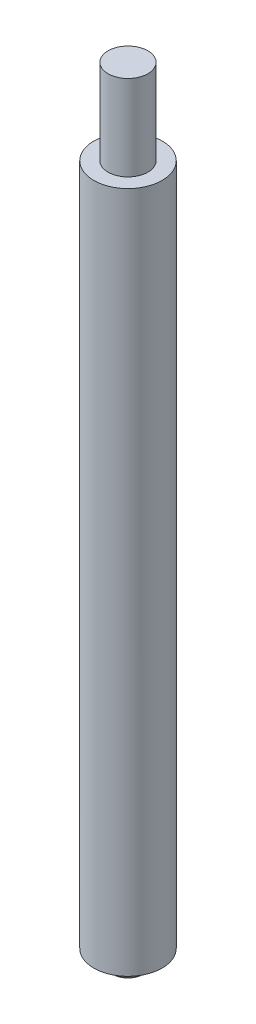
ISO-10303-21;
HEADER;
FILE_DESCRIPTION(('STEP AP214'),'2;1');
FILE_NAME('part.step','',(''),(''),'','','');
FILE_SCHEMA(('AUTOMOTIVE_DESIGN { 1 0 10303 214 1 1 1 1 }'));
ENDSEC;
DATA;
#1=APPLICATION_CONTEXT('core data for automotive mechanical design processes');
#2=APPLICATION_PROTOCOL_DEFINITION('international standard','automotive_design',2000,#1);
#3=PRODUCT_CONTEXT('',#1,'mechanical');
#4=PRODUCT('Part','Part','',(#3));
#5=PRODUCT_RELATED_PRODUCT_CATEGORY('part','',(#4));
#6=PRODUCT_DEFINITION_FORMATION('','',#4);
#7=PRODUCT_DEFINITION_CONTEXT('part definition',#1,'design');
#8=PRODUCT_DEFINITION('design','',#6,#7);
#9=PRODUCT_DEFINITION_SHAPE('','',#8);
#10=(LENGTH_UNIT() NAMED_UNIT(*) SI_UNIT(.MILLI.,.METRE.));
#11=(NAMED_UNIT(*) PLANE_ANGLE_UNIT() SI_UNIT($,.RADIAN.));
#12=(NAMED_UNIT(*) SI_UNIT($,.STERADIAN.) SOLID_ANGLE_UNIT());
#13=UNCERTAINTY_MEASURE_WITH_UNIT(LENGTH_MEASURE(1.E-05),#10,'distance_accuracy_value','');
#14=(GEOMETRIC_REPRESENTATION_CONTEXT(3) GLOBAL_UNCERTAINTY_ASSIGNED_CONTEXT((#13)) GLOBAL_UNIT_ASSIGNED_CONTEXT((#10,
#11,#12)) REPRESENTATION_CONTEXT('',''));
#15=CARTESIAN_POINT('',(0.,0.,0.));
#16=DIRECTION('',(0.,0.,1.));
#17=DIRECTION('',(1.,0.,0.));
#18=AXIS2_PLACEMENT_3D('',#15,#16,#17);
#19=CARTESIAN_POINT('',(-97.9858734622431,-22.870352222622,67.9054394861145));
#20=DIRECTION('',(0.,1.,0.));
#21=DIRECTION('',(1.,0.,0.));
#22=AXIS2_PLACEMENT_3D('',#19,#20,#21);
#23=PLANE('',#22);
#24=CARTESIAN_POINT('',(-96.5721765279553,-22.8703522226222,73.8228541123755));
#25=CARTESIAN_POINT('',(-96.5678260502752,-22.8703522226222,73.8435794193445));
#26=CARTESIAN_POINT('',(-96.5623770568825,-22.8703522226222,73.8640989212002));
#27=CARTESIAN_POINT('',(-96.5558401171276,-22.8703522226222,73.8843241617577));
#28=CARTESIAN_POINT('',(-96.5317525572248,-22.8703522226222,73.9588508840073));
#29=CARTESIAN_POINT('',(-96.4933489727974,-22.8703522226221,74.0279708231255));
#30=CARTESIAN_POINT('',(-96.4427811416982,-22.8703522226221,74.0877801707159));
#31=CARTESIAN_POINT('',(-96.3922995758884,-22.8703522226221,74.1474874876167));
#32=CARTESIAN_POINT('',(-96.330654159784,-22.870352222622,74.1967813069358));
#33=CARTESIAN_POINT('',(-96.2612949105251,-22.870352222622,74.23286910676));
#34=CARTESIAN_POINT('',(-96.1920509199817,-22.870352222622,74.2688969371714));
#35=CARTESIAN_POINT('',(-96.1164434075436,-22.870352222622,74.2910727687485));
#36=CARTESIAN_POINT('',(-96.0387088372715,-22.870352222622,74.2981297324957));
#37=CARTESIAN_POINT('',(-95.9610266768258,-22.870352222622,74.3051819383309));
#38=CARTESIAN_POINT('',(-95.8827169696455,-22.8703522226219,74.2969993340753));
#39=CARTESIAN_POINT('',(-95.8081731707342,-22.8703522226219,74.2740339420394));
#40=CARTESIAN_POINT('',(-95.7335732287633,-22.8703522226219,74.2510512534961));
#41=CARTESIAN_POINT('',(-95.6641874156283,-22.870352222622,74.2137080971474));
#42=CARTESIAN_POINT('',(-95.6039051839047,-22.870352222622,74.1641137920299));
#43=CARTESIAN_POINT('',(-95.543514616199,-22.870352222622,74.1144303586967));
#44=CARTESIAN_POINT('',(-95.4934258231242,-22.8703522226221,74.0534112071373));
#45=CARTESIAN_POINT('',(-95.4564364063864,-22.8703522226221,73.9845084659685));
#46=CARTESIAN_POINT('',(-95.4193806744219,-22.8703522226221,73.9154821948472));
#47=CARTESIAN_POINT('',(-95.3961809587493,-22.8703522226224,73.8398669097778));
#48=CARTESIAN_POINT('',(-95.3881220608928,-22.8703522226224,73.7619367553003));
#49=CARTESIAN_POINT('',(-95.3817014873842,-22.8703522226224,73.6998493217262));
#50=CARTESIAN_POINT('',(-95.3849883879078,-22.8703522226224,73.6372311463605));
#51=CARTESIAN_POINT('',(-95.397772510781,-22.8703522226224,73.5763288163803));
#52=B_SPLINE_CURVE_WITH_KNOTS('',3,(#24,#25,#26,#27,#28,#29,#30,#31,#32,#33,#34,#35,#36,#37,#38,
#39,#40,#41,#42,#43,#44,#45,#46,#47,#48,#49,#50,#51),.UNSPECIFIED.,.F.,.F.,(4,3,3,3,3,3,3,3,3,
4),(0.0906286338490975,0.0970048547971925,0.120500192034242,0.143955447819833,0.167371726501718,
0.190772217573301,0.214190332849484,0.237650533901896,0.261152794783485,0.279877190636576),.UNSPECIFIED.);
#53=CARTESIAN_POINT('',(-96.5721766503632,-22.870352222622,73.8228541380703));
#54=VERTEX_POINT('',#53);
#55=CARTESIAN_POINT('',(-95.3977724434223,-22.870352222622,73.5763288022409));
#56=VERTEX_POINT('',#55);
#57=EDGE_CURVE('P0_E11',#54,#56,#52,.T.);
#58=ORIENTED_EDGE('',*,*,#57,.T.);
#59=CARTESIAN_POINT('',(-95.397772510781,-22.8703522226224,73.5763288163803));
#60=CARTESIAN_POINT('',(-95.4010456859748,-22.8703522226224,73.5607357250351));
#61=CARTESIAN_POINT('',(-95.4049414384028,-22.8703522226224,73.5452551135535));
#62=CARTESIAN_POINT('',(-95.409456239205,-22.8703522226224,73.529924688609));
#63=CARTESIAN_POINT('',(-95.4315860140885,-22.8703522226224,73.4547809850999));
#64=CARTESIAN_POINT('',(-95.4681704440311,-22.8703522226222,73.3846664830277));
#65=CARTESIAN_POINT('',(-95.51716027325,-22.8703522226222,73.3235426049768));
#66=CARTESIAN_POINT('',(-95.5660594961008,-22.8703522226222,73.2625317751377));
#67=CARTESIAN_POINT('',(-95.6263903102962,-22.870352222622,73.2116366113214));
#68=CARTESIAN_POINT('',(-95.6947791253152,-22.870352222622,73.1737406724828));
#69=CARTESIAN_POINT('',(-95.748529026263,-22.870352222622,73.1439565190605));
#70=CARTESIAN_POINT('',(-95.80644642432,-22.870352222622,73.1226511297557));
#71=CARTESIAN_POINT('',(-95.8664819944071,-22.870352222622,73.1104975345015));
#72=B_SPLINE_CURVE_WITH_KNOTS('',3,(#59,#60,#61,#62,#63,#64,#65,#66,#67,#68,#69,#70,#71),
.UNSPECIFIED.,.F.,.F.,(4,3,3,3,4),(0.279877190636576,0.284671280041969,0.308170017629412,
0.331625294455703,0.350059870427905),.UNSPECIFIED.);
#73=CARTESIAN_POINT('',(-95.8664819944077,-22.870352222622,73.1104975345014));
#74=VERTEX_POINT('',#73);
#75=EDGE_CURVE('P0_E31',#56,#74,#72,.T.);
#76=ORIENTED_EDGE('',*,*,#75,.T.);
#77=CARTESIAN_POINT('',(-95.8664819944071,-22.870352222622,73.1104975345015));
#78=CARTESIAN_POINT('',(-95.8827000733265,-22.870352222622,73.1072143481055));
#79=CARTESIAN_POINT('',(-95.899072714911,-22.870352222622,73.1045989582061));
#80=CARTESIAN_POINT('',(-95.9155595245947,-22.870352222622,73.1026646605131));
#81=CARTESIAN_POINT('',(-95.9930286463105,-22.870352222622,73.0935756768782));
#82=CARTESIAN_POINT('',(-96.0715245349503,-22.8703522236215,73.0997004818225));
#83=CARTESIAN_POINT('',(-96.1466441789284,-22.8703522236215,73.1207014613094));
#84=CARTESIAN_POINT('',(-96.1892102298489,-22.8703522236215,73.132601527855));
#85=CARTESIAN_POINT('',(-96.2303273848794,-22.870352222622,73.1491761425467));
#86=CARTESIAN_POINT('',(-96.2692475759991,-22.870352222622,73.1701214581213));
#87=CARTESIAN_POINT('',(-96.3081760347507,-22.870352222622,73.1910712230102));
#88=CARTESIAN_POINT('',(-96.3446660994206,-22.8703522226219,73.2162640925919));
#89=CARTESIAN_POINT('',(-96.3780554770065,-22.8703522226219,73.2452379502376));
#90=CARTESIAN_POINT('',(-96.4371333856962,-22.8703522226219,73.2965032040442));
#91=CARTESIAN_POINT('',(-96.4856143840525,-22.870352222622,73.3588325752559));
#92=CARTESIAN_POINT('',(-96.5207897489313,-22.870352222622,73.4286993023566));
#93=CARTESIAN_POINT('',(-96.5560205009987,-22.870352222622,73.4986760417231));
#94=CARTESIAN_POINT('',(-96.5772301053577,-22.8703522226222,73.5748750280968));
#95=CARTESIAN_POINT('',(-96.5832427104637,-22.8703522226222,73.6529908384452));
#96=CARTESIAN_POINT('',(-96.5876271609219,-22.8703522226222,73.7099536514762));
#97=CARTESIAN_POINT('',(-96.5838700188268,-22.8703522226222,73.7671473128759));
#98=CARTESIAN_POINT('',(-96.5721765279553,-22.8703522226222,73.8228541123755));
#99=B_SPLINE_CURVE_WITH_KNOTS('',3,(#77,#78,#79,#80,#81,#82,#83,#84,#85,#86,#87,#88,#89,#90,#91,
#92,#93,#94,#95,#96,#97,#98),.UNSPECIFIED.,.F.,.F.,(4,3,3,3,3,3,3,4),(-0.0283799417962128,
-0.0234000039438561,0.,0.0132594579349294,0.0265217325137007,0.0499875022654272,
0.0734902212575653,0.0906286338490975),.UNSPECIFIED.);
#100=EDGE_CURVE('P0_E52',#74,#54,#99,.T.);
#101=ORIENTED_EDGE('',*,*,#100,.T.);
#102=EDGE_LOOP('',(#58,#76,#101));
#103=FACE_BOUND('',#102,.T.);
#104=ADVANCED_FACE('P0_F17',(#103),#23,.T.);
#105=CARTESIAN_POINT('',(-95.8664819944071,-22.870352222622,73.1104975345015));
#106=CARTESIAN_POINT('',(-95.8664819944071,-34.870352222622,73.1104975345015));
#107=CARTESIAN_POINT('',(-95.80644642432,-22.870352222622,73.1226511297557));
#108=CARTESIAN_POINT('',(-95.80644642432,-34.870352222622,73.1226511297557));
#109=CARTESIAN_POINT('',(-95.748529026263,-22.870352222622,73.1439565190605));
#110=CARTESIAN_POINT('',(-95.748529026263,-34.870352222622,73.1439565190605));
#111=CARTESIAN_POINT('',(-95.6263903102962,-22.870352222622,73.2116366113214));
#112=CARTESIAN_POINT('',(-95.6263903102962,-34.870352222622,73.2116366113214));
#113=CARTESIAN_POINT('',(-95.5660594961008,-22.8703522226222,73.2625317751377));
#114=CARTESIAN_POINT('',(-95.5660594961008,-34.8703522226222,73.2625317751377));
#115=CARTESIAN_POINT('',(-95.4681704440311,-22.8703522226222,73.3846664830277));
#116=CARTESIAN_POINT('',(-95.4681704440311,-34.8703522226222,73.3846664830277));
#117=CARTESIAN_POINT('',(-95.4315860140885,-22.8703522226224,73.4547809850999));
#118=CARTESIAN_POINT('',(-95.4315860140885,-34.8703522226224,73.4547809850999));
#119=CARTESIAN_POINT('',(-95.3873078670879,-22.8703522226224,73.6051315407502));
#120=CARTESIAN_POINT('',(-95.3873078670879,-34.8703522226224,73.6051315407502));
#121=CARTESIAN_POINT('',(-95.3800575997162,-22.8703522226224,73.6839528030966));
#122=CARTESIAN_POINT('',(-95.3800575997162,-34.8703522226224,73.6839528030966));
#123=CARTESIAN_POINT('',(-95.3961809587493,-22.8703522226224,73.8398669097778));
#124=CARTESIAN_POINT('',(-95.3961809587493,-34.8703522226224,73.8398669097778));
#125=CARTESIAN_POINT('',(-95.4193806744219,-22.8703522226221,73.9154821948472));
#126=CARTESIAN_POINT('',(-95.4193806744219,-34.8703522226222,73.9154821948472));
#127=CARTESIAN_POINT('',(-95.4934258231242,-22.8703522226221,74.0534112071373));
#128=CARTESIAN_POINT('',(-95.4934258231242,-34.8703522226222,74.0534112071373));
#129=CARTESIAN_POINT('',(-95.543514616199,-22.870352222622,74.1144303586967));
#130=CARTESIAN_POINT('',(-95.543514616199,-34.870352222622,74.1144303586967));
#131=CARTESIAN_POINT('',(-95.6641874156283,-22.870352222622,74.2137080971474));
#132=CARTESIAN_POINT('',(-95.6641874156283,-34.870352222622,74.2137080971474));
#133=CARTESIAN_POINT('',(-95.7335732287633,-22.8703522226219,74.2510512534961));
#134=CARTESIAN_POINT('',(-95.7335732287633,-34.8703522226219,74.2510512534961));
#135=CARTESIAN_POINT('',(-95.8827169696455,-22.8703522226219,74.2969993340753));
#136=CARTESIAN_POINT('',(-95.8827169696455,-34.8703522226219,74.2969993340753));
#137=CARTESIAN_POINT('',(-95.9610266768258,-22.870352222622,74.3051819383309));
#138=CARTESIAN_POINT('',(-95.9610266768258,-34.870352222622,74.3051819383309));
#139=CARTESIAN_POINT('',(-96.1164434075436,-22.870352222622,74.2910727687485));
#140=CARTESIAN_POINT('',(-96.1164434075436,-34.870352222622,74.2910727687485));
#141=CARTESIAN_POINT('',(-96.1920509199817,-22.870352222622,74.2688969371714));
#142=CARTESIAN_POINT('',(-96.1920509199817,-34.870352222622,74.2688969371714));
#143=CARTESIAN_POINT('',(-96.330654159784,-22.870352222622,74.1967813069358));
#144=CARTESIAN_POINT('',(-96.330654159784,-34.870352222622,74.1967813069358));
#145=CARTESIAN_POINT('',(-96.3922995758884,-22.8703522226221,74.1474874876167));
#146=CARTESIAN_POINT('',(-96.3922995758884,-34.8703522226221,74.1474874876167));
#147=CARTESIAN_POINT('',(-96.4933489727974,-22.8703522226221,74.0279708231255));
#148=CARTESIAN_POINT('',(-96.4933489727974,-34.8703522226221,74.0279708231255));
#149=CARTESIAN_POINT('',(-96.5317525572248,-22.8703522226222,73.9588508840073));
#150=CARTESIAN_POINT('',(-96.5317525572248,-34.8703522226222,73.9588508840073));
#151=CARTESIAN_POINT('',(-96.5799474597149,-22.8703522226222,73.8097362320368));
#152=CARTESIAN_POINT('',(-96.5799474597149,-34.8703522226222,73.8097362320368));
#153=CARTESIAN_POINT('',(-96.5892583636199,-22.8703522226222,73.7311462490853));
#154=CARTESIAN_POINT('',(-96.5892583636199,-34.8703522226222,73.7311462490853));
#155=CARTESIAN_POINT('',(-96.5772301053577,-22.8703522226222,73.5748750280968));
#156=CARTESIAN_POINT('',(-96.5772301053577,-34.8703522226222,73.5748750280968));
#157=CARTESIAN_POINT('',(-96.5560205009987,-22.870352222622,73.4986760417231));
#158=CARTESIAN_POINT('',(-96.5560205009987,-34.8703522226221,73.4986760417231));
#159=CARTESIAN_POINT('',(-96.4856143840525,-22.870352222622,73.3588325752559));
#160=CARTESIAN_POINT('',(-96.4856143840525,-34.8703522226221,73.3588325752559));
#161=CARTESIAN_POINT('',(-96.4371333856962,-22.8703522226219,73.2965032040442));
#162=CARTESIAN_POINT('',(-96.4371333856962,-34.8703522226219,73.2965032040442));
#163=CARTESIAN_POINT('',(-96.3446660994206,-22.8703522226219,73.2162640925919));
#164=CARTESIAN_POINT('',(-96.3446660994206,-34.8703522226219,73.2162640925919));
#165=CARTESIAN_POINT('',(-96.3081760347507,-22.870352222622,73.1910712230102));
#166=CARTESIAN_POINT('',(-96.3081760347507,-34.870352222622,73.1910712230102));
#167=CARTESIAN_POINT('',(-96.2303273848794,-22.870352222622,73.1491761425467));
#168=CARTESIAN_POINT('',(-96.2303273848794,-34.870352222622,73.1491761425467));
#169=CARTESIAN_POINT('',(-96.1892102298489,-22.8703522236215,73.132601527855));
#170=CARTESIAN_POINT('',(-96.1892102298489,-34.8703522236215,73.132601527855));
#171=CARTESIAN_POINT('',(-96.1466441789284,-22.8703522236215,73.1207014613094));
#172=CARTESIAN_POINT('',(-96.1466441789284,-34.8703522236215,73.1207014613094));
#173=CARTESIAN_POINT('',(-96.0715245349503,-22.8703522236215,73.0997004818225));
#174=CARTESIAN_POINT('',(-96.0715245349503,-34.8703522236215,73.0997004818225));
#175=CARTESIAN_POINT('',(-95.9930286463105,-22.870352222622,73.0935756768782));
#176=CARTESIAN_POINT('',(-95.9930286463105,-34.870352222622,73.0935756768782));
#177=CARTESIAN_POINT('',(-95.899072714911,-22.870352222622,73.1045989582061));
#178=CARTESIAN_POINT('',(-95.899072714911,-34.870352222622,73.1045989582061));
#179=CARTESIAN_POINT('',(-95.8827000733265,-22.870352222622,73.1072143481055));
#180=CARTESIAN_POINT('',(-95.8827000733265,-34.870352222622,73.1072143481055));
#181=CARTESIAN_POINT('',(-95.8664819944071,-22.870352222622,73.1104975345015));
#182=CARTESIAN_POINT('',(-95.8664819944071,-34.870352222622,73.1104975345015));
#183=B_SPLINE_SURFACE_WITH_KNOTS('',3,1,((#105,#106),(#107,#108),(#109,#110),(#111,#112),(#113,
#114),(#115,#116),(#117,#118),(#119,#120),(#121,#122),(#123,#124),(#125,#126),(#127,#128),(#129,
#130),(#131,#132),(#133,#134),(#135,#136),(#137,#138),(#139,#140),(#141,#142),(#143,#144),(#145,
#146),(#147,#148),(#149,#150),(#151,#152),(#153,#154),(#155,#156),(#157,#158),(#159,#160),(#161,
#162),(#163,#164),(#165,#166),(#167,#168),(#169,#170),(#171,#172),(#173,#174),(#175,#176),(#177,
#178),(#179,#180),(#181,#182)),.UNSPECIFIED.,.T.,.F.,.F.,(4,2,2,2,2,2,2,2,2,2,2,2,2,2,2,2,3,2,
4),(2,2),(-0.350059870427905,-0.331625294455703,-0.308170017629412,-0.284671280041969,
-0.261152794783485,-0.237650533901896,-0.214190332849484,-0.190772217573301,-0.167371726501718,
-0.143955447819833,-0.120500192034242,-0.0970048547971925,-0.0734902212575653,
-0.0499875022654273,-0.0265217325137007,-0.0132594579349294,0.,0.0234000039438561,
0.0283799417962128),(0.,1.2),.UNSPECIFIED.);
#184=CARTESIAN_POINT('',(-95.8664819944071,-34.870352222622,73.1104975345015));
#185=CARTESIAN_POINT('',(-95.80644642432,-34.870352222622,73.1226511297557));
#186=CARTESIAN_POINT('',(-95.748529026263,-34.870352222622,73.1439565190605));
#187=CARTESIAN_POINT('',(-95.6947791253152,-34.870352222622,73.1737406724828));
#188=CARTESIAN_POINT('',(-95.6263903102962,-34.870352222622,73.2116366113214));
#189=CARTESIAN_POINT('',(-95.5660594961008,-34.8703522226222,73.2625317751377));
#190=CARTESIAN_POINT('',(-95.51716027325,-34.8703522226222,73.3235426049768));
#191=CARTESIAN_POINT('',(-95.4681704440311,-34.8703522226222,73.3846664830277));
#192=CARTESIAN_POINT('',(-95.4315860140885,-34.8703522226223,73.4547809850999));
#193=CARTESIAN_POINT('',(-95.409456239205,-34.8703522226223,73.529924688609));
#194=CARTESIAN_POINT('',(-95.3873078670879,-34.8703522226223,73.6051315407502));
#195=CARTESIAN_POINT('',(-95.3800575997162,-34.8703522226224,73.6839528030966));
#196=CARTESIAN_POINT('',(-95.3881220608928,-34.8703522226224,73.7619367553003));
#197=CARTESIAN_POINT('',(-95.3961809587493,-34.8703522226224,73.8398669097778));
#198=CARTESIAN_POINT('',(-95.4193806744219,-34.8703522226221,73.9154821948472));
#199=CARTESIAN_POINT('',(-95.4564364063864,-34.8703522226221,73.9845084659685));
#200=CARTESIAN_POINT('',(-95.4934258231242,-34.8703522226221,74.0534112071373));
#201=CARTESIAN_POINT('',(-95.543514616199,-34.870352222622,74.1144303586967));
#202=CARTESIAN_POINT('',(-95.6039051839047,-34.870352222622,74.1641137920299));
#203=CARTESIAN_POINT('',(-95.6641874156283,-34.870352222622,74.2137080971474));
#204=CARTESIAN_POINT('',(-95.7335732287633,-34.8703522226219,74.2510512534961));
#205=CARTESIAN_POINT('',(-95.8081731707342,-34.8703522226219,74.2740339420394));
#206=CARTESIAN_POINT('',(-95.8827169696455,-34.8703522226219,74.2969993340753));
#207=CARTESIAN_POINT('',(-95.9610266768258,-34.870352222622,74.3051819383309));
#208=CARTESIAN_POINT('',(-96.0387088372715,-34.870352222622,74.2981297324957));
#209=CARTESIAN_POINT('',(-96.1164434075436,-34.870352222622,74.2910727687485));
#210=CARTESIAN_POINT('',(-96.1920509199817,-34.8703522226219,74.2688969371714));
#211=CARTESIAN_POINT('',(-96.2612949105251,-34.8703522226219,74.23286910676));
#212=CARTESIAN_POINT('',(-96.330654159784,-34.8703522226219,74.1967813069358));
#213=CARTESIAN_POINT('',(-96.3922995758884,-34.870352222622,74.1474874876167));
#214=CARTESIAN_POINT('',(-96.4427811416982,-34.870352222622,74.0877801707159));
#215=CARTESIAN_POINT('',(-96.4933489727974,-34.870352222622,74.0279708231255));
#216=CARTESIAN_POINT('',(-96.5317525572248,-34.8703522226221,73.9588508840073));
#217=CARTESIAN_POINT('',(-96.5558401171276,-34.8703522226221,73.8843241617577));
#218=CARTESIAN_POINT('',(-96.5799474597149,-34.8703522226221,73.8097362320368));
#219=CARTESIAN_POINT('',(-96.5892583636199,-34.8703522226221,73.7311462490853));
#220=CARTESIAN_POINT('',(-96.5832427104637,-34.8703522226221,73.6529908384452));
#221=CARTESIAN_POINT('',(-96.5772301053577,-34.8703522226221,73.5748750280968));
#222=CARTESIAN_POINT('',(-96.5560205009987,-34.870352222622,73.4986760417231));
#223=CARTESIAN_POINT('',(-96.5207897489313,-34.870352222622,73.4286993023566));
#224=CARTESIAN_POINT('',(-96.4856143840525,-34.870352222622,73.3588325752559));
#225=CARTESIAN_POINT('',(-96.4371333856962,-34.8703522226219,73.2965032040442));
#226=CARTESIAN_POINT('',(-96.3780554770065,-34.8703522226219,73.2452379502376));
#227=CARTESIAN_POINT('',(-96.3446660994206,-34.8703522226219,73.2162640925919));
#228=CARTESIAN_POINT('',(-96.3081760347507,-34.8703522226219,73.1910712230102));
#229=CARTESIAN_POINT('',(-96.2692475759991,-34.8703522226219,73.1701214581213));
#230=CARTESIAN_POINT('',(-96.2303273848794,-34.8703522226219,73.1491761425467));
#231=CARTESIAN_POINT('',(-96.1892102298489,-34.8703522236214,73.132601527855));
#232=CARTESIAN_POINT('',(-96.1466441789284,-34.8703522236214,73.1207014613094));
#233=CARTESIAN_POINT('',(-96.0715245349503,-34.8703522236214,73.0997004818225));
#234=CARTESIAN_POINT('',(-95.9930286463105,-34.8703522226219,73.0935756768782));
#235=CARTESIAN_POINT('',(-95.9155595245947,-34.8703522226219,73.1026646605131));
#236=CARTESIAN_POINT('',(-95.899072714911,-34.8703522226219,73.1045989582061));
#237=CARTESIAN_POINT('',(-95.8827000733265,-34.870352222622,73.1072143481055));
#238=CARTESIAN_POINT('',(-95.8664819944071,-34.870352222622,73.1104975345015));
#239=B_SPLINE_CURVE_WITH_KNOTS('',3,(#184,#185,#186,#187,#188,#189,#190,#191,#192,#193,#194,
#195,#196,#197,#198,#199,#200,#201,#202,#203,#204,#205,#206,#207,#208,#209,#210,#211,#212,#213,
#214,#215,#216,#217,#218,#219,#220,#221,#222,#223,#224,#225,#226,#227,#228,#229,#230,#231,#232,
#233,#234,#235,#236,#237,#238),.UNSPECIFIED.,.T.,.F.,(4,3,3,3,3,3,3,3,3,3,3,3,3,3,3,3,3,3,4),
(-0.350059870427905,-0.331625294455703,-0.308170017629412,-0.284671280041968,-0.261152794783485,
-0.237650533901896,-0.214190332849483,-0.1907722175733,-0.167371726501717,-0.143955447819831,
-0.120500192034241,-0.0970048547971911,-0.0734902212575638,-0.0499875022654256,
-0.0265217325136989,-0.0132594579349276,0.,0.0234000039438581,0.0283799417962128),.UNSPECIFIED.);
#240=CARTESIAN_POINT('',(-95.8664819944071,-34.870352222622,73.1104975345015));
#241=VERTEX_POINT('',#240);
#242=EDGE_CURVE('P0_E23',#241,#241,#239,.T.);
#243=ORIENTED_EDGE('',*,*,#242,.F.);
#244=EDGE_LOOP('',(#243));
#245=FACE_BOUND('',#244,.T.);
#246=ORIENTED_EDGE('',*,*,#100,.F.);
#247=ORIENTED_EDGE('',*,*,#75,.F.);
#248=ORIENTED_EDGE('',*,*,#57,.F.);
#249=EDGE_LOOP('',(#246,#247,#248));
#250=FACE_BOUND('',#249,.T.);
#251=ADVANCED_FACE('P0_F19',(#245,#250),#183,.T.);
#252=CARTESIAN_POINT('',(-97.9780006835161,-34.870352222622,67.894749538687));
#253=DIRECTION('',(0.,1.,0.));
#254=DIRECTION('',(1.,0.,0.));
#255=AXIS2_PLACEMENT_3D('',#252,#253,#254);
#256=PLANE('',#255);
#257=ORIENTED_EDGE('',*,*,#242,.T.);
#258=EDGE_LOOP('',(#257));
#259=FACE_BOUND('',#258,.T.);
#260=ADVANCED_FACE('P0_F80',(#259),#256,.F.);
#261=CLOSED_SHELL('',(#104,#251,#260));
#262=MANIFOLD_SOLID_BREP('P0_B1',#261);
#263=CARTESIAN_POINT('',(-81.665808000505,-21.3703528404236,27.730238100206));
#264=DIRECTION('',(0.,1.,0.));
#265=DIRECTION('',(0.,0.,-1.));
#266=AXIS2_PLACEMENT_3D('',#263,#264,#265);
#267=PLANE('',#266);
#268=CARTESIAN_POINT('',(-95.9849745468928,-21.3703528404236,73.6995914701556));
#269=DIRECTION('',(0.,1.,0.));
#270=DIRECTION('',(2.1425115015461E-09,0.,1.));
#271=AXIS2_PLACEMENT_3D('',#268,#269,#270);
#272=CIRCLE('',#271,0.35);
#273=CARTESIAN_POINT('',(-95.9849745461429,-21.3703528404236,74.0495914701556));
#274=VERTEX_POINT('',#273);
#275=EDGE_CURVE('P1_E10',#274,#274,#272,.T.);
#276=ORIENTED_EDGE('',*,*,#275,.T.);
#277=EDGE_LOOP('',(#276));
#278=FACE_BOUND('',#277,.T.);
#279=ADVANCED_FACE('P1_F15',(#278),#267,.T.);
#280=CARTESIAN_POINT('',(-95.9849745468928,-22.8703528404236,73.6995914701556));
#281=DIRECTION('',(0.,1.,0.));
#282=DIRECTION('',(2.1425115015461E-09,0.,1.));
#283=AXIS2_PLACEMENT_3D('',#280,#281,#282);
#284=CYLINDRICAL_SURFACE('',#283,0.35);
#285=CARTESIAN_POINT('',(-95.9849745468928,-34.9703528404236,73.6995914701556));
#286=DIRECTION('',(0.,-1.,0.));
#287=DIRECTION('',(2.14248936052691E-09,0.,1.));
#288=AXIS2_PLACEMENT_3D('',#285,#286,#287);
#289=CIRCLE('',#288,0.35);
#290=CARTESIAN_POINT('',(-95.9849745461429,-34.9703528404236,74.0495914701556));
#291=VERTEX_POINT('',#290);
#292=EDGE_CURVE('P1_E23',#291,#291,#289,.T.);
#293=ORIENTED_EDGE('',*,*,#292,.F.);
#294=EDGE_LOOP('',(#293));
#295=FACE_BOUND('',#294,.T.);
#296=ORIENTED_EDGE('',*,*,#275,.F.);
#297=EDGE_LOOP('',(#296));
#298=FACE_BOUND('',#297,.T.);
#299=ADVANCED_FACE('P1_F49',(#295,#298),#284,.T.);
#300=CARTESIAN_POINT('',(-81.665808000505,-35.1703528404236,27.730238100206));
#301=DIRECTION('',(0.,1.,0.));
#302=DIRECTION('',(0.,0.,-1.));
#303=AXIS2_PLACEMENT_3D('',#300,#301,#302);
#304=PLANE('',#303);
#305=CARTESIAN_POINT('',(-95.9849745468928,-35.1703528404236,73.6995914701556));
#306=DIRECTION('',(0.,1.,0.));
#307=DIRECTION('',(2.14248936052691E-09,0.,1.));
#308=AXIS2_PLACEMENT_3D('',#305,#306,#307);
#309=CIRCLE('',#308,0.15);
#310=CARTESIAN_POINT('',(-95.9849745465714,-35.1703528404236,73.8495914701556));
#311=VERTEX_POINT('',#310);
#312=EDGE_CURVE('P1_E33',#311,#311,#309,.T.);
#313=ORIENTED_EDGE('',*,*,#312,.F.);
#314=EDGE_LOOP('',(#313));
#315=FACE_BOUND('',#314,.T.);
#316=ADVANCED_FACE('P1_F47',(#315),#304,.F.);
#317=CARTESIAN_POINT('',(-95.9849745468928,-34.9703528404236,73.6995914701556));
#318=DIRECTION('',(0.,-1.,0.));
#319=DIRECTION('',(0.,0.,-1.));
#320=AXIS2_PLACEMENT_3D('',#317,#318,#319);
#321=DEGENERATE_TOROIDAL_SURFACE('',#320,0.150000000000025,0.200000000000005,.T.);
#322=ORIENTED_EDGE('',*,*,#292,.T.);
#323=EDGE_LOOP('',(#322));
#324=FACE_BOUND('',#323,.T.);
#325=ORIENTED_EDGE('',*,*,#312,.T.);
#326=EDGE_LOOP('',(#325));
#327=FACE_BOUND('',#326,.T.);
#328=ADVANCED_FACE('P1_F17',(#324,#327),#321,.T.);
#329=CLOSED_SHELL('',(#279,#299,#316,#328));
#330=MANIFOLD_SOLID_BREP('P1_B1',#329);
#331=ADVANCED_BREP_SHAPE_REPRESENTATION('',(#18,#262,#330),#14);
#332=SHAPE_DEFINITION_REPRESENTATION(#9,#331);
ENDSEC;
END-ISO-10303-21;
